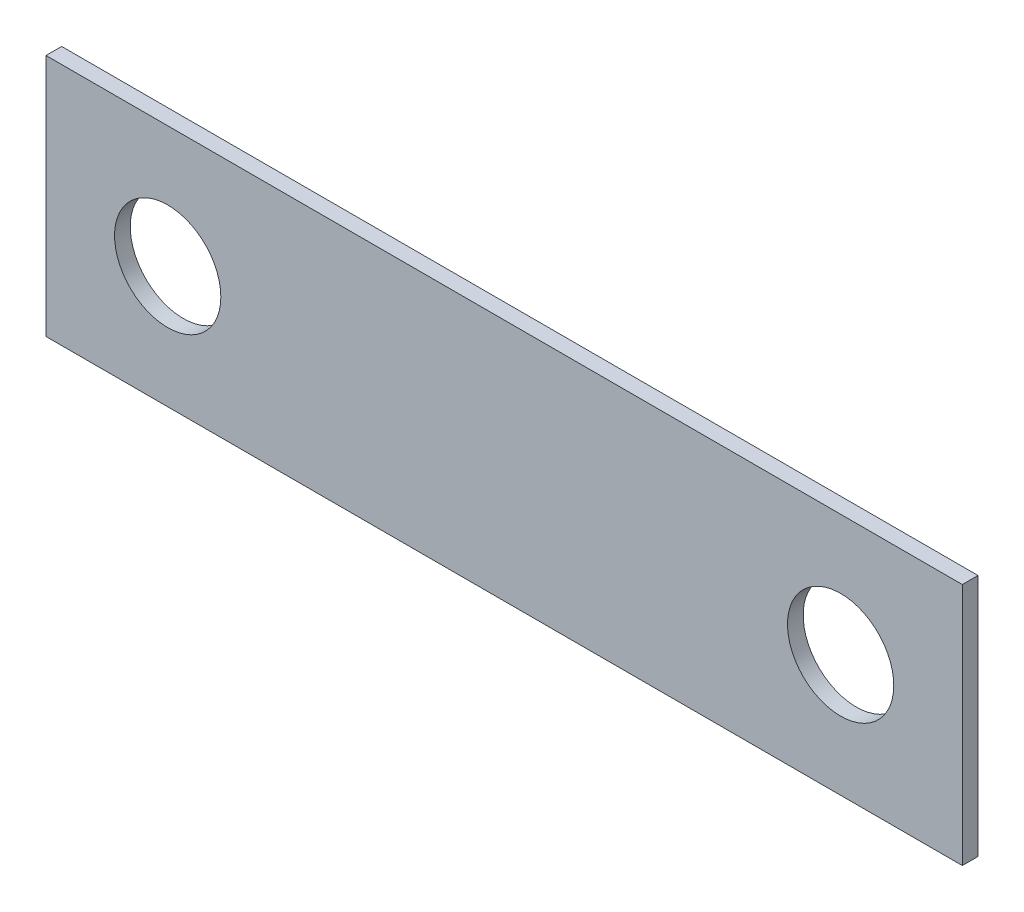
ISO-10303-21;
HEADER;
FILE_DESCRIPTION(('STEP AP214'),'2;1');
FILE_NAME('part.step','',(''),(''),'','','');
FILE_SCHEMA(('AUTOMOTIVE_DESIGN { 1 0 10303 214 1 1 1 1 }'));
ENDSEC;
DATA;
#1=APPLICATION_CONTEXT('core data for automotive mechanical design processes');
#2=APPLICATION_PROTOCOL_DEFINITION('international standard','automotive_design',2000,#1);
#3=PRODUCT_CONTEXT('',#1,'mechanical');
#4=PRODUCT('Part','Part','',(#3));
#5=PRODUCT_RELATED_PRODUCT_CATEGORY('part','',(#4));
#6=PRODUCT_DEFINITION_FORMATION('','',#4);
#7=PRODUCT_DEFINITION_CONTEXT('part definition',#1,'design');
#8=PRODUCT_DEFINITION('design','',#6,#7);
#9=PRODUCT_DEFINITION_SHAPE('','',#8);
#10=(LENGTH_UNIT() NAMED_UNIT(*) SI_UNIT(.MILLI.,.METRE.));
#11=(NAMED_UNIT(*) PLANE_ANGLE_UNIT() SI_UNIT($,.RADIAN.));
#12=(NAMED_UNIT(*) SI_UNIT($,.STERADIAN.) SOLID_ANGLE_UNIT());
#13=UNCERTAINTY_MEASURE_WITH_UNIT(LENGTH_MEASURE(1.E-05),#10,'distance_accuracy_value','');
#14=(GEOMETRIC_REPRESENTATION_CONTEXT(3) GLOBAL_UNCERTAINTY_ASSIGNED_CONTEXT((#13)) GLOBAL_UNIT_ASSIGNED_CONTEXT((#10,
#11,#12)) REPRESENTATION_CONTEXT('',''));
#15=CARTESIAN_POINT('',(0.,0.,0.));
#16=DIRECTION('',(0.,0.,1.));
#17=DIRECTION('',(1.,0.,0.));
#18=AXIS2_PLACEMENT_3D('',#15,#16,#17);
#19=CARTESIAN_POINT('',(0.,0.,0.4572));
#20=DIRECTION('',(0.,0.,-1.));
#21=DIRECTION('',(-1.,0.,0.));
#22=AXIS2_PLACEMENT_3D('',#19,#20,#21);
#23=PLANE('',#22);
#24=DIRECTION('',(0.,-1.,0.));
#25=VECTOR('',#24,1.);
#26=CARTESIAN_POINT('',(0.,0.,0.4572));
#27=LINE('',#26,#25);
#28=CARTESIAN_POINT('',(0.,7.1,0.4572));
#29=VERTEX_POINT('',#28);
#30=CARTESIAN_POINT('',(0.,0.,0.4572));
#31=VERTEX_POINT('',#30);
#32=EDGE_CURVE('E98',#29,#31,#27,.T.);
#33=ORIENTED_EDGE('',*,*,#32,.T.);
#34=DIRECTION('',(1.,0.,0.));
#35=VECTOR('',#34,1.);
#36=CARTESIAN_POINT('',(0.,0.,0.4572));
#37=LINE('',#36,#35);
#38=CARTESIAN_POINT('',(26.73,0.,0.4572));
#39=VERTEX_POINT('',#38);
#40=EDGE_CURVE('E93',#31,#39,#37,.T.);
#41=ORIENTED_EDGE('',*,*,#40,.T.);
#42=DIRECTION('',(0.,1.,0.));
#43=VECTOR('',#42,1.);
#44=CARTESIAN_POINT('',(26.73,0.,0.4572));
#45=LINE('',#44,#43);
#46=CARTESIAN_POINT('',(26.73,7.1,0.4572));
#47=VERTEX_POINT('',#46);
#48=EDGE_CURVE('E96',#39,#47,#45,.T.);
#49=ORIENTED_EDGE('',*,*,#48,.T.);
#50=DIRECTION('',(-1.,0.,0.));
#51=VECTOR('',#50,1.);
#52=CARTESIAN_POINT('',(0.,7.1,0.4572));
#53=LINE('',#52,#51);
#54=EDGE_CURVE('E63',#47,#29,#53,.T.);
#55=ORIENTED_EDGE('',*,*,#54,.T.);
#56=EDGE_LOOP('',(#33,#41,#49,#55));
#57=FACE_BOUND('',#56,.T.);
#58=CARTESIAN_POINT('',(3.55,3.55,0.4572));
#59=DIRECTION('',(0.,0.,1.));
#60=DIRECTION('',(1.,0.,0.));
#61=AXIS2_PLACEMENT_3D('',#58,#59,#60);
#62=CIRCLE('',#61,1.55);
#63=CARTESIAN_POINT('',(5.1,3.55,0.4572));
#64=VERTEX_POINT('',#63);
#65=EDGE_CURVE('E118',#64,#64,#62,.T.);
#66=ORIENTED_EDGE('',*,*,#65,.F.);
#67=EDGE_LOOP('',(#66));
#68=FACE_BOUND('',#67,.T.);
#69=CARTESIAN_POINT('',(23.18,3.55,0.4572));
#70=DIRECTION('',(0.,0.,1.));
#71=DIRECTION('',(1.,0.,0.));
#72=AXIS2_PLACEMENT_3D('',#69,#70,#71);
#73=CIRCLE('',#72,1.55);
#74=CARTESIAN_POINT('',(24.73,3.55,0.4572));
#75=VERTEX_POINT('',#74);
#76=EDGE_CURVE('E140',#75,#75,#73,.T.);
#77=ORIENTED_EDGE('',*,*,#76,.F.);
#78=EDGE_LOOP('',(#77));
#79=FACE_BOUND('',#78,.T.);
#80=ADVANCED_FACE('F45',(#57,#68,#79),#23,.F.);
#81=CARTESIAN_POINT('',(0.,0.,0.));
#82=DIRECTION('',(0.,0.,-1.));
#83=DIRECTION('',(-1.,0.,0.));
#84=AXIS2_PLACEMENT_3D('',#81,#82,#83);
#85=PLANE('',#84);
#86=CARTESIAN_POINT('',(3.55,3.55,0.));
#87=DIRECTION('',(0.,0.,1.));
#88=DIRECTION('',(1.,0.,0.));
#89=AXIS2_PLACEMENT_3D('',#86,#87,#88);
#90=CIRCLE('',#89,1.55);
#91=CARTESIAN_POINT('',(5.1,3.55,0.));
#92=VERTEX_POINT('',#91);
#93=EDGE_CURVE('E136',#92,#92,#90,.T.);
#94=ORIENTED_EDGE('',*,*,#93,.T.);
#95=EDGE_LOOP('',(#94));
#96=FACE_BOUND('',#95,.T.);
#97=DIRECTION('',(0.,-1.,0.));
#98=VECTOR('',#97,1.);
#99=CARTESIAN_POINT('',(0.,0.,0.));
#100=LINE('',#99,#98);
#101=CARTESIAN_POINT('',(0.,7.1,0.));
#102=VERTEX_POINT('',#101);
#103=CARTESIAN_POINT('',(0.,0.,0.));
#104=VERTEX_POINT('',#103);
#105=EDGE_CURVE('E114',#102,#104,#100,.T.);
#106=ORIENTED_EDGE('',*,*,#105,.F.);
#107=DIRECTION('',(-1.,0.,0.));
#108=VECTOR('',#107,1.);
#109=CARTESIAN_POINT('',(0.,7.1,0.));
#110=LINE('',#109,#108);
#111=CARTESIAN_POINT('',(26.73,7.1,0.));
#112=VERTEX_POINT('',#111);
#113=EDGE_CURVE('E86',#112,#102,#110,.T.);
#114=ORIENTED_EDGE('',*,*,#113,.F.);
#115=DIRECTION('',(0.,1.,0.));
#116=VECTOR('',#115,1.);
#117=CARTESIAN_POINT('',(26.73,0.,0.));
#118=LINE('',#117,#116);
#119=CARTESIAN_POINT('',(26.73,0.,0.));
#120=VERTEX_POINT('',#119);
#121=EDGE_CURVE('E80',#120,#112,#118,.T.);
#122=ORIENTED_EDGE('',*,*,#121,.F.);
#123=DIRECTION('',(1.,0.,0.));
#124=VECTOR('',#123,1.);
#125=CARTESIAN_POINT('',(0.,0.,0.));
#126=LINE('',#125,#124);
#127=EDGE_CURVE('E103',#104,#120,#126,.T.);
#128=ORIENTED_EDGE('',*,*,#127,.F.);
#129=EDGE_LOOP('',(#106,#114,#122,#128));
#130=FACE_BOUND('',#129,.T.);
#131=CARTESIAN_POINT('',(23.18,3.55,0.));
#132=DIRECTION('',(0.,0.,1.));
#133=DIRECTION('',(1.,0.,0.));
#134=AXIS2_PLACEMENT_3D('',#131,#132,#133);
#135=CIRCLE('',#134,1.55);
#136=CARTESIAN_POINT('',(24.73,3.55,0.));
#137=VERTEX_POINT('',#136);
#138=EDGE_CURVE('E144',#137,#137,#135,.T.);
#139=ORIENTED_EDGE('',*,*,#138,.T.);
#140=EDGE_LOOP('',(#139));
#141=FACE_BOUND('',#140,.T.);
#142=ADVANCED_FACE('F131',(#96,#130,#141),#85,.T.);
#143=CARTESIAN_POINT('',(0.,0.,0.4572));
#144=DIRECTION('',(1.,0.,0.));
#145=DIRECTION('',(0.,0.,-1.));
#146=AXIS2_PLACEMENT_3D('',#143,#144,#145);
#147=PLANE('',#146);
#148=ORIENTED_EDGE('',*,*,#105,.T.);
#149=DIRECTION('',(0.,0.,-1.));
#150=VECTOR('',#149,1.);
#151=CARTESIAN_POINT('',(0.,0.,0.4572));
#152=LINE('',#151,#150);
#153=EDGE_CURVE('E11',#31,#104,#152,.T.);
#154=ORIENTED_EDGE('',*,*,#153,.F.);
#155=ORIENTED_EDGE('',*,*,#32,.F.);
#156=DIRECTION('',(0.,0.,-1.));
#157=VECTOR('',#156,1.);
#158=CARTESIAN_POINT('',(0.,7.1,0.4572));
#159=LINE('',#158,#157);
#160=EDGE_CURVE('E110',#29,#102,#159,.T.);
#161=ORIENTED_EDGE('',*,*,#160,.T.);
#162=EDGE_LOOP('',(#148,#154,#155,#161));
#163=FACE_BOUND('',#162,.T.);
#164=ADVANCED_FACE('F47',(#163),#147,.F.);
#165=CARTESIAN_POINT('',(0.,0.,0.4572));
#166=DIRECTION('',(0.,1.,0.));
#167=DIRECTION('',(0.,0.,1.));
#168=AXIS2_PLACEMENT_3D('',#165,#166,#167);
#169=PLANE('',#168);
#170=ORIENTED_EDGE('',*,*,#127,.T.);
#171=DIRECTION('',(0.,0.,-1.));
#172=VECTOR('',#171,1.);
#173=CARTESIAN_POINT('',(26.73,0.,0.4572));
#174=LINE('',#173,#172);
#175=EDGE_CURVE('E55',#39,#120,#174,.T.);
#176=ORIENTED_EDGE('',*,*,#175,.F.);
#177=ORIENTED_EDGE('',*,*,#40,.F.);
#178=ORIENTED_EDGE('',*,*,#153,.T.);
#179=EDGE_LOOP('',(#170,#176,#177,#178));
#180=FACE_BOUND('',#179,.T.);
#181=ADVANCED_FACE('F102',(#180),#169,.F.);
#182=CARTESIAN_POINT('',(26.73,0.,0.4572));
#183=DIRECTION('',(-1.,0.,0.));
#184=DIRECTION('',(0.,0.,1.));
#185=AXIS2_PLACEMENT_3D('',#182,#183,#184);
#186=PLANE('',#185);
#187=ORIENTED_EDGE('',*,*,#121,.T.);
#188=DIRECTION('',(0.,0.,-1.));
#189=VECTOR('',#188,1.);
#190=CARTESIAN_POINT('',(26.73,7.1,0.4572));
#191=LINE('',#190,#189);
#192=EDGE_CURVE('E105',#47,#112,#191,.T.);
#193=ORIENTED_EDGE('',*,*,#192,.F.);
#194=ORIENTED_EDGE('',*,*,#48,.F.);
#195=ORIENTED_EDGE('',*,*,#175,.T.);
#196=EDGE_LOOP('',(#187,#193,#194,#195));
#197=FACE_BOUND('',#196,.T.);
#198=ADVANCED_FACE('F106',(#197),#186,.F.);
#199=CARTESIAN_POINT('',(0.,7.1,0.4572));
#200=DIRECTION('',(0.,-1.,0.));
#201=DIRECTION('',(0.,0.,-1.));
#202=AXIS2_PLACEMENT_3D('',#199,#200,#201);
#203=PLANE('',#202);
#204=ORIENTED_EDGE('',*,*,#113,.T.);
#205=ORIENTED_EDGE('',*,*,#160,.F.);
#206=ORIENTED_EDGE('',*,*,#54,.F.);
#207=ORIENTED_EDGE('',*,*,#192,.T.);
#208=EDGE_LOOP('',(#204,#205,#206,#207));
#209=FACE_BOUND('',#208,.T.);
#210=ADVANCED_FACE('F128',(#209),#203,.F.);
#211=CARTESIAN_POINT('',(3.55,3.55,0.4572));
#212=DIRECTION('',(0.,0.,-1.));
#213=DIRECTION('',(-1.,0.,0.));
#214=AXIS2_PLACEMENT_3D('',#211,#212,#213);
#215=CYLINDRICAL_SURFACE('',#214,1.55);
#216=ORIENTED_EDGE('',*,*,#65,.T.);
#217=EDGE_LOOP('',(#216));
#218=FACE_BOUND('',#217,.T.);
#219=ORIENTED_EDGE('',*,*,#93,.F.);
#220=EDGE_LOOP('',(#219));
#221=FACE_BOUND('',#220,.T.);
#222=ADVANCED_FACE('F163',(#218,#221),#215,.F.);
#223=CARTESIAN_POINT('',(23.18,3.55,0.4572));
#224=DIRECTION('',(0.,0.,-1.));
#225=DIRECTION('',(-1.,0.,0.));
#226=AXIS2_PLACEMENT_3D('',#223,#224,#225);
#227=CYLINDRICAL_SURFACE('',#226,1.55);
#228=ORIENTED_EDGE('',*,*,#76,.T.);
#229=EDGE_LOOP('',(#228));
#230=FACE_BOUND('',#229,.T.);
#231=ORIENTED_EDGE('',*,*,#138,.F.);
#232=EDGE_LOOP('',(#231));
#233=FACE_BOUND('',#232,.T.);
#234=ADVANCED_FACE('F152',(#230,#233),#227,.F.);
#235=CLOSED_SHELL('',(#80,#142,#164,#181,#198,#210,#222,#234));
#236=MANIFOLD_SOLID_BREP('B2',#235);
#237=ADVANCED_BREP_SHAPE_REPRESENTATION('',(#18,#236),#14);
#238=SHAPE_DEFINITION_REPRESENTATION(#9,#237);
ENDSEC;
END-ISO-10303-21;
